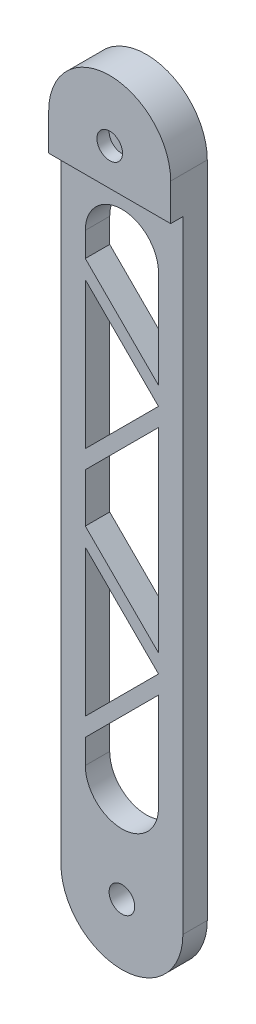
ISO-10303-21;
HEADER;
FILE_DESCRIPTION(('STEP AP214'),'2;1');
FILE_NAME('part.step','',(''),(''),'','','');
FILE_SCHEMA(('AUTOMOTIVE_DESIGN { 1 0 10303 214 1 1 1 1 }'));
ENDSEC;
DATA;
#1=APPLICATION_CONTEXT('core data for automotive mechanical design processes');
#2=APPLICATION_PROTOCOL_DEFINITION('international standard','automotive_design',2000,#1);
#3=PRODUCT_CONTEXT('',#1,'mechanical');
#4=PRODUCT('Part','Part','',(#3));
#5=PRODUCT_RELATED_PRODUCT_CATEGORY('part','',(#4));
#6=PRODUCT_DEFINITION_FORMATION('','',#4);
#7=PRODUCT_DEFINITION_CONTEXT('part definition',#1,'design');
#8=PRODUCT_DEFINITION('design','',#6,#7);
#9=PRODUCT_DEFINITION_SHAPE('','',#8);
#10=(LENGTH_UNIT() NAMED_UNIT(*) SI_UNIT(.MILLI.,.METRE.));
#11=(NAMED_UNIT(*) PLANE_ANGLE_UNIT() SI_UNIT($,.RADIAN.));
#12=(NAMED_UNIT(*) SI_UNIT($,.STERADIAN.) SOLID_ANGLE_UNIT());
#13=UNCERTAINTY_MEASURE_WITH_UNIT(LENGTH_MEASURE(1.E-05),#10,'distance_accuracy_value','');
#14=(GEOMETRIC_REPRESENTATION_CONTEXT(3) GLOBAL_UNCERTAINTY_ASSIGNED_CONTEXT((#13)) GLOBAL_UNIT_ASSIGNED_CONTEXT((#10,
#11,#12)) REPRESENTATION_CONTEXT('',''));
#15=CARTESIAN_POINT('',(0.,0.,0.));
#16=DIRECTION('',(0.,0.,1.));
#17=DIRECTION('',(1.,0.,0.));
#18=AXIS2_PLACEMENT_3D('',#15,#16,#17);
#19=CARTESIAN_POINT('',(0.,0.,4.));
#20=DIRECTION('',(0.,0.,1.));
#21=DIRECTION('',(1.,0.,0.));
#22=AXIS2_PLACEMENT_3D('',#19,#20,#21);
#23=PLANE('',#22);
#24=DIRECTION('',(0.,-1.,0.));
#25=VECTOR('',#24,1.);
#26=CARTESIAN_POINT('',(5.99999999999999,0.,4.));
#27=LINE('',#26,#25);
#28=CARTESIAN_POINT('',(5.99999999999999,38.,4.));
#29=VERTEX_POINT('',#28);
#30=CARTESIAN_POINT('',(5.99999999999999,22.0000000000018,4.));
#31=VERTEX_POINT('',#30);
#32=EDGE_CURVE('E389',#29,#31,#27,.T.);
#33=ORIENTED_EDGE('',*,*,#32,.T.);
#34=DIRECTION('',(0.707106781186546,-0.707106781186549,0.));
#35=VECTOR('',#34,1.);
#36=CARTESIAN_POINT('',(14.0000000000009,14.0000000000008,4.));
#37=LINE('',#36,#35);
#38=CARTESIAN_POINT('',(-6.00000000000002,34.0000000000018,4.));
#39=VERTEX_POINT('',#38);
#40=EDGE_CURVE('E408',#39,#31,#37,.T.);
#41=ORIENTED_EDGE('',*,*,#40,.F.);
#42=DIRECTION('',(0.,-1.,0.));
#43=VECTOR('',#42,1.);
#44=CARTESIAN_POINT('',(-6.00000000000002,0.,4.));
#45=LINE('',#44,#43);
#46=CARTESIAN_POINT('',(-6.00000000000002,38.,4.));
#47=VERTEX_POINT('',#46);
#48=EDGE_CURVE('E368',#47,#39,#45,.T.);
#49=ORIENTED_EDGE('',*,*,#48,.F.);
#50=CARTESIAN_POINT('',(0.,38.,4.));
#51=DIRECTION('',(0.,0.,1.));
#52=DIRECTION('',(1.,0.,0.));
#53=AXIS2_PLACEMENT_3D('',#50,#51,#52);
#54=CIRCLE('',#53,6.00000000000001);
#55=EDGE_CURVE('E415',#29,#47,#54,.T.);
#56=ORIENTED_EDGE('',*,*,#55,.F.);
#57=EDGE_LOOP('',(#33,#41,#49,#56));
#58=FACE_BOUND('',#57,.T.);
#59=DIRECTION('',(0.707106781186546,-0.707106781186549,0.));
#60=VECTOR('',#59,1.);
#61=CARTESIAN_POINT('',(12.5000000000017,12.5000000000016,4.));
#62=LINE('',#61,#60);
#63=CARTESIAN_POINT('',(-6.00000000000002,31.0000000000034,4.));
#64=VERTEX_POINT('',#63);
#65=CARTESIAN_POINT('',(5.99999999999999,19.0000000000002,4.));
#66=VERTEX_POINT('',#65);
#67=EDGE_CURVE('E370',#64,#66,#62,.T.);
#68=ORIENTED_EDGE('',*,*,#67,.T.);
#69=DIRECTION('',(0.707106781186546,0.707106781186549,0.));
#70=VECTOR('',#69,1.);
#71=CARTESIAN_POINT('',(-6.50000000000011,6.50000000000008,4.));
#72=LINE('',#71,#70);
#73=CARTESIAN_POINT('',(-6.00000000000002,7.00000000000017,4.));
#74=VERTEX_POINT('',#73);
#75=EDGE_CURVE('E373',#74,#66,#72,.T.);
#76=ORIENTED_EDGE('',*,*,#75,.F.);
#77=EDGE_CURVE('E251',#64,#74,#45,.T.);
#78=ORIENTED_EDGE('',*,*,#77,.F.);
#79=EDGE_LOOP('',(#68,#76,#78));
#80=FACE_BOUND('',#79,.T.);
#81=CARTESIAN_POINT('',(5.99999999999999,16.0000000000018,4.));
#82=VERTEX_POINT('',#81);
#83=CARTESIAN_POINT('',(5.99999999999999,-16.0000000000018,4.));
#84=VERTEX_POINT('',#83);
#85=EDGE_CURVE('E382',#82,#84,#27,.T.);
#86=ORIENTED_EDGE('',*,*,#85,.T.);
#87=DIRECTION('',(0.707106781186546,-0.707106781186549,0.));
#88=VECTOR('',#87,1.);
#89=CARTESIAN_POINT('',(-5.00000000000088,-5.00000000000086,4.));
#90=LINE('',#89,#88);
#91=CARTESIAN_POINT('',(-6.00000000000002,-4.00000000000172,4.));
#92=VERTEX_POINT('',#91);
#93=EDGE_CURVE('E383',#92,#84,#90,.T.);
#94=ORIENTED_EDGE('',*,*,#93,.F.);
#95=CARTESIAN_POINT('',(-6.00000000000002,4.00000000000172,4.));
#96=VERTEX_POINT('',#95);
#97=EDGE_CURVE('E367',#96,#92,#45,.T.);
#98=ORIENTED_EDGE('',*,*,#97,.F.);
#99=DIRECTION('',(0.707106781186546,0.707106781186549,0.));
#100=VECTOR('',#99,1.);
#101=CARTESIAN_POINT('',(-5.00000000000088,5.00000000000086,4.));
#102=LINE('',#101,#100);
#103=EDGE_CURVE('E380',#96,#82,#102,.T.);
#104=ORIENTED_EDGE('',*,*,#103,.T.);
#105=EDGE_LOOP('',(#86,#94,#98,#104));
#106=FACE_BOUND('',#105,.T.);
#107=DIRECTION('',(0.707106781186546,-0.707106781186549,0.));
#108=VECTOR('',#107,1.);
#109=CARTESIAN_POINT('',(-6.50000000000011,-6.50000000000008,4.));
#110=LINE('',#109,#108);
#111=CARTESIAN_POINT('',(-6.00000000000002,-7.00000000000017,4.));
#112=VERTEX_POINT('',#111);
#113=CARTESIAN_POINT('',(5.99999999999999,-19.0000000000033,4.));
#114=VERTEX_POINT('',#113);
#115=EDGE_CURVE('E394',#112,#114,#110,.T.);
#116=ORIENTED_EDGE('',*,*,#115,.T.);
#117=DIRECTION('',(0.707106781186546,0.707106781186549,0.));
#118=VECTOR('',#117,1.);
#119=CARTESIAN_POINT('',(12.5000000000017,-12.5000000000016,4.));
#120=LINE('',#119,#118);
#121=CARTESIAN_POINT('',(-6.00000000000002,-31.0000000000034,4.));
#122=VERTEX_POINT('',#121);
#123=EDGE_CURVE('E396',#122,#114,#120,.T.);
#124=ORIENTED_EDGE('',*,*,#123,.F.);
#125=EDGE_CURVE('E392',#112,#122,#45,.T.);
#126=ORIENTED_EDGE('',*,*,#125,.F.);
#127=EDGE_LOOP('',(#116,#124,#126));
#128=FACE_BOUND('',#127,.T.);
#129=DIRECTION('',(0.707106781186546,0.707106781186549,0.));
#130=VECTOR('',#129,1.);
#131=CARTESIAN_POINT('',(14.0000000000009,-14.0000000000008,4.));
#132=LINE('',#131,#130);
#133=CARTESIAN_POINT('',(-6.00000000000002,-34.0000000000018,4.));
#134=VERTEX_POINT('',#133);
#135=CARTESIAN_POINT('',(5.99999999999999,-22.0000000000018,4.));
#136=VERTEX_POINT('',#135);
#137=EDGE_CURVE('E402',#134,#136,#132,.T.);
#138=ORIENTED_EDGE('',*,*,#137,.T.);
#139=CARTESIAN_POINT('',(5.99999999999999,-38.,4.));
#140=VERTEX_POINT('',#139);
#141=EDGE_CURVE('E386',#136,#140,#27,.T.);
#142=ORIENTED_EDGE('',*,*,#141,.T.);
#143=CARTESIAN_POINT('',(0.,-38.,4.));
#144=DIRECTION('',(0.,0.,1.));
#145=DIRECTION('',(1.,0.,0.));
#146=AXIS2_PLACEMENT_3D('',#143,#144,#145);
#147=CIRCLE('',#146,6.00000000000001);
#148=CARTESIAN_POINT('',(-6.00000000000002,-38.,4.));
#149=VERTEX_POINT('',#148);
#150=EDGE_CURVE('E403',#149,#140,#147,.T.);
#151=ORIENTED_EDGE('',*,*,#150,.F.);
#152=EDGE_CURVE('E399',#134,#149,#45,.T.);
#153=ORIENTED_EDGE('',*,*,#152,.F.);
#154=EDGE_LOOP('',(#138,#142,#151,#153));
#155=FACE_BOUND('',#154,.T.);
#156=CARTESIAN_POINT('',(0.,-54.,4.));
#157=DIRECTION('',(0.,0.,1.));
#158=DIRECTION('',(1.,0.,0.));
#159=AXIS2_PLACEMENT_3D('',#156,#157,#158);
#160=CIRCLE('',#159,2.1);
#161=CARTESIAN_POINT('',(2.09999999999999,-54.,4.));
#162=VERTEX_POINT('',#161);
#163=EDGE_CURVE('E275',#162,#162,#160,.T.);
#164=ORIENTED_EDGE('',*,*,#163,.F.);
#165=EDGE_LOOP('',(#164));
#166=FACE_BOUND('',#165,.T.);
#167=DIRECTION('',(0.,-1.,0.));
#168=VECTOR('',#167,1.);
#169=CARTESIAN_POINT('',(10.,0.,4.));
#170=LINE('',#169,#168);
#171=CARTESIAN_POINT('',(10.,47.95,4.));
#172=VERTEX_POINT('',#171);
#173=CARTESIAN_POINT('',(9.99999999999999,-54.,4.));
#174=VERTEX_POINT('',#173);
#175=EDGE_CURVE('E350',#172,#174,#170,.T.);
#176=ORIENTED_EDGE('',*,*,#175,.F.);
#177=DIRECTION('',(-1.,0.,0.));
#178=VECTOR('',#177,1.);
#179=CARTESIAN_POINT('',(0.,47.95,4.));
#180=LINE('',#179,#178);
#181=CARTESIAN_POINT('',(-9.99999999999999,47.95,4.));
#182=VERTEX_POINT('',#181);
#183=EDGE_CURVE('E141',#172,#182,#180,.T.);
#184=ORIENTED_EDGE('',*,*,#183,.T.);
#185=DIRECTION('',(0.,-1.,0.));
#186=VECTOR('',#185,1.);
#187=CARTESIAN_POINT('',(-9.99999999999999,0.,4.));
#188=LINE('',#187,#186);
#189=CARTESIAN_POINT('',(-9.99999999999999,-54.,4.));
#190=VERTEX_POINT('',#189);
#191=EDGE_CURVE('E420',#182,#190,#188,.T.);
#192=ORIENTED_EDGE('',*,*,#191,.T.);
#193=CARTESIAN_POINT('',(0.,-54.,4.));
#194=DIRECTION('',(0.,0.,1.));
#195=DIRECTION('',(1.,0.,0.));
#196=AXIS2_PLACEMENT_3D('',#193,#194,#195);
#197=CIRCLE('',#196,10.);
#198=EDGE_CURVE('E263',#190,#174,#197,.T.);
#199=ORIENTED_EDGE('',*,*,#198,.T.);
#200=EDGE_LOOP('',(#176,#184,#192,#199));
#201=FACE_BOUND('',#200,.T.);
#202=ADVANCED_FACE('F131',(#58,#80,#106,#128,#155,#166,#201),#23,.T.);
#203=CARTESIAN_POINT('',(5.99999999999999,0.,4.));
#204=DIRECTION('',(1.,0.,0.));
#205=DIRECTION('',(0.,0.,-1.));
#206=AXIS2_PLACEMENT_3D('',#203,#204,#205);
#207=PLANE('',#206);
#208=DIRECTION('',(0.,-1.,0.));
#209=VECTOR('',#208,1.);
#210=CARTESIAN_POINT('',(5.99999999999999,0.,0.));
#211=LINE('',#210,#209);
#212=CARTESIAN_POINT('',(5.99999999999999,38.,0.));
#213=VERTEX_POINT('',#212);
#214=CARTESIAN_POINT('',(5.99999999999999,22.0000000000018,0.));
#215=VERTEX_POINT('',#214);
#216=EDGE_CURVE('E443',#213,#215,#211,.T.);
#217=ORIENTED_EDGE('',*,*,#216,.T.);
#218=DIRECTION('',(0.,0.,-1.));
#219=VECTOR('',#218,1.);
#220=CARTESIAN_POINT('',(5.99999999999999,22.0000000000018,4.));
#221=LINE('',#220,#219);
#222=EDGE_CURVE('E157',#31,#215,#221,.T.);
#223=ORIENTED_EDGE('',*,*,#222,.F.);
#224=ORIENTED_EDGE('',*,*,#32,.F.);
#225=DIRECTION('',(0.,0.,-1.));
#226=VECTOR('',#225,1.);
#227=CARTESIAN_POINT('',(5.99999999999999,38.,4.));
#228=LINE('',#227,#226);
#229=EDGE_CURVE('E306',#29,#213,#228,.T.);
#230=ORIENTED_EDGE('',*,*,#229,.T.);
#231=EDGE_LOOP('',(#217,#223,#224,#230));
#232=FACE_BOUND('',#231,.T.);
#233=ADVANCED_FACE('F478',(#232),#207,.F.);
#234=CARTESIAN_POINT('',(5.99999999999999,16.0000000000018,0.));
#235=VERTEX_POINT('',#234);
#236=CARTESIAN_POINT('',(5.99999999999999,-16.0000000000018,0.));
#237=VERTEX_POINT('',#236);
#238=EDGE_CURVE('E437',#235,#237,#211,.T.);
#239=ORIENTED_EDGE('',*,*,#238,.T.);
#240=DIRECTION('',(0.,0.,-1.));
#241=VECTOR('',#240,1.);
#242=CARTESIAN_POINT('',(5.99999999999999,-16.0000000000018,4.));
#243=LINE('',#242,#241);
#244=EDGE_CURVE('E334',#84,#237,#243,.T.);
#245=ORIENTED_EDGE('',*,*,#244,.F.);
#246=ORIENTED_EDGE('',*,*,#85,.F.);
#247=DIRECTION('',(0.,0.,-1.));
#248=VECTOR('',#247,1.);
#249=CARTESIAN_POINT('',(5.99999999999999,16.0000000000018,4.));
#250=LINE('',#249,#248);
#251=EDGE_CURVE('E339',#82,#235,#250,.T.);
#252=ORIENTED_EDGE('',*,*,#251,.T.);
#253=EDGE_LOOP('',(#239,#245,#246,#252));
#254=FACE_BOUND('',#253,.T.);
#255=ADVANCED_FACE('F521',(#254),#207,.F.);
#256=CARTESIAN_POINT('',(5.99999999999999,-22.0000000000018,0.));
#257=VERTEX_POINT('',#256);
#258=CARTESIAN_POINT('',(5.99999999999999,-38.,0.));
#259=VERTEX_POINT('',#258);
#260=EDGE_CURVE('E444',#257,#259,#211,.T.);
#261=ORIENTED_EDGE('',*,*,#260,.T.);
#262=DIRECTION('',(0.,0.,-1.));
#263=VECTOR('',#262,1.);
#264=CARTESIAN_POINT('',(5.99999999999999,-38.,4.));
#265=LINE('',#264,#263);
#266=EDGE_CURVE('E312',#140,#259,#265,.T.);
#267=ORIENTED_EDGE('',*,*,#266,.F.);
#268=ORIENTED_EDGE('',*,*,#141,.F.);
#269=DIRECTION('',(0.,0.,-1.));
#270=VECTOR('',#269,1.);
#271=CARTESIAN_POINT('',(5.99999999999999,-22.0000000000018,4.));
#272=LINE('',#271,#270);
#273=EDGE_CURVE('E320',#136,#257,#272,.T.);
#274=ORIENTED_EDGE('',*,*,#273,.T.);
#275=EDGE_LOOP('',(#261,#267,#268,#274));
#276=FACE_BOUND('',#275,.T.);
#277=ADVANCED_FACE('F610',(#276),#207,.F.);
#278=CARTESIAN_POINT('',(0.,-38.,4.));
#279=DIRECTION('',(0.,0.,-1.));
#280=DIRECTION('',(-1.,0.,0.));
#281=AXIS2_PLACEMENT_3D('',#278,#279,#280);
#282=CYLINDRICAL_SURFACE('',#281,6.00000000000001);
#283=CARTESIAN_POINT('',(0.,-38.,0.));
#284=DIRECTION('',(0.,0.,1.));
#285=DIRECTION('',(1.,0.,0.));
#286=AXIS2_PLACEMENT_3D('',#283,#284,#285);
#287=CIRCLE('',#286,6.00000000000001);
#288=CARTESIAN_POINT('',(-6.00000000000002,-38.,0.));
#289=VERTEX_POINT('',#288);
#290=EDGE_CURVE('E463',#289,#259,#287,.T.);
#291=ORIENTED_EDGE('',*,*,#290,.F.);
#292=DIRECTION('',(0.,0.,-1.));
#293=VECTOR('',#292,1.);
#294=CARTESIAN_POINT('',(-6.00000000000002,-38.,4.));
#295=LINE('',#294,#293);
#296=EDGE_CURVE('E309',#149,#289,#295,.T.);
#297=ORIENTED_EDGE('',*,*,#296,.F.);
#298=ORIENTED_EDGE('',*,*,#150,.T.);
#299=ORIENTED_EDGE('',*,*,#266,.T.);
#300=EDGE_LOOP('',(#291,#297,#298,#299));
#301=FACE_BOUND('',#300,.T.);
#302=ADVANCED_FACE('F692',(#301),#282,.F.);
#303=CARTESIAN_POINT('',(-6.00000000000002,0.,4.));
#304=DIRECTION('',(1.,0.,0.));
#305=DIRECTION('',(0.,0.,-1.));
#306=AXIS2_PLACEMENT_3D('',#303,#304,#305);
#307=PLANE('',#306);
#308=DIRECTION('',(0.,-1.,0.));
#309=VECTOR('',#308,1.);
#310=CARTESIAN_POINT('',(-6.00000000000002,0.,0.));
#311=LINE('',#310,#309);
#312=CARTESIAN_POINT('',(-6.00000000000002,38.,0.));
#313=VERTEX_POINT('',#312);
#314=CARTESIAN_POINT('',(-6.00000000000002,34.0000000000018,0.));
#315=VERTEX_POINT('',#314);
#316=EDGE_CURVE('E428',#313,#315,#311,.T.);
#317=ORIENTED_EDGE('',*,*,#316,.F.);
#318=DIRECTION('',(0.,0.,-1.));
#319=VECTOR('',#318,1.);
#320=CARTESIAN_POINT('',(-6.00000000000002,38.,4.));
#321=LINE('',#320,#319);
#322=EDGE_CURVE('E296',#47,#313,#321,.T.);
#323=ORIENTED_EDGE('',*,*,#322,.F.);
#324=ORIENTED_EDGE('',*,*,#48,.T.);
#325=DIRECTION('',(0.,0.,-1.));
#326=VECTOR('',#325,1.);
#327=CARTESIAN_POINT('',(-6.00000000000002,34.0000000000018,4.));
#328=LINE('',#327,#326);
#329=EDGE_CURVE('E291',#39,#315,#328,.T.);
#330=ORIENTED_EDGE('',*,*,#329,.T.);
#331=EDGE_LOOP('',(#317,#323,#324,#330));
#332=FACE_BOUND('',#331,.T.);
#333=ADVANCED_FACE('F489',(#332),#307,.T.);
#334=CARTESIAN_POINT('',(-6.00000000000002,31.0000000000034,0.));
#335=VERTEX_POINT('',#334);
#336=CARTESIAN_POINT('',(-6.00000000000002,7.00000000000017,0.));
#337=VERTEX_POINT('',#336);
#338=EDGE_CURVE('E293',#335,#337,#311,.T.);
#339=ORIENTED_EDGE('',*,*,#338,.F.);
#340=DIRECTION('',(0.,0.,-1.));
#341=VECTOR('',#340,1.);
#342=CARTESIAN_POINT('',(-6.00000000000002,31.0000000000034,4.));
#343=LINE('',#342,#341);
#344=EDGE_CURVE('E337',#64,#335,#343,.T.);
#345=ORIENTED_EDGE('',*,*,#344,.F.);
#346=ORIENTED_EDGE('',*,*,#77,.T.);
#347=DIRECTION('',(0.,0.,-1.));
#348=VECTOR('',#347,1.);
#349=CARTESIAN_POINT('',(-6.00000000000002,7.00000000000017,4.));
#350=LINE('',#349,#348);
#351=EDGE_CURVE('E343',#74,#337,#350,.T.);
#352=ORIENTED_EDGE('',*,*,#351,.T.);
#353=EDGE_LOOP('',(#339,#345,#346,#352));
#354=FACE_BOUND('',#353,.T.);
#355=ADVANCED_FACE('F673',(#354),#307,.T.);
#356=CARTESIAN_POINT('',(-6.00000000000002,4.00000000000172,0.));
#357=VERTEX_POINT('',#356);
#358=CARTESIAN_POINT('',(-6.00000000000002,-4.00000000000172,0.));
#359=VERTEX_POINT('',#358);
#360=EDGE_CURVE('E430',#357,#359,#311,.T.);
#361=ORIENTED_EDGE('',*,*,#360,.F.);
#362=DIRECTION('',(0.,0.,-1.));
#363=VECTOR('',#362,1.);
#364=CARTESIAN_POINT('',(-6.00000000000002,4.00000000000172,4.));
#365=LINE('',#364,#363);
#366=EDGE_CURVE('E329',#96,#357,#365,.T.);
#367=ORIENTED_EDGE('',*,*,#366,.F.);
#368=ORIENTED_EDGE('',*,*,#97,.T.);
#369=DIRECTION('',(0.,0.,-1.));
#370=VECTOR('',#369,1.);
#371=CARTESIAN_POINT('',(-6.00000000000002,-4.00000000000172,4.));
#372=LINE('',#371,#370);
#373=EDGE_CURVE('E335',#92,#359,#372,.T.);
#374=ORIENTED_EDGE('',*,*,#373,.T.);
#375=EDGE_LOOP('',(#361,#367,#368,#374));
#376=FACE_BOUND('',#375,.T.);
#377=ADVANCED_FACE('F535',(#376),#307,.T.);
#378=CARTESIAN_POINT('',(-6.00000000000002,-7.00000000000017,0.));
#379=VERTEX_POINT('',#378);
#380=CARTESIAN_POINT('',(-6.00000000000002,-31.0000000000034,0.));
#381=VERTEX_POINT('',#380);
#382=EDGE_CURVE('E446',#379,#381,#311,.T.);
#383=ORIENTED_EDGE('',*,*,#382,.F.);
#384=DIRECTION('',(0.,0.,-1.));
#385=VECTOR('',#384,1.);
#386=CARTESIAN_POINT('',(-6.00000000000002,-7.00000000000017,4.));
#387=LINE('',#386,#385);
#388=EDGE_CURVE('E313',#112,#379,#387,.T.);
#389=ORIENTED_EDGE('',*,*,#388,.F.);
#390=ORIENTED_EDGE('',*,*,#125,.T.);
#391=DIRECTION('',(0.,0.,-1.));
#392=VECTOR('',#391,1.);
#393=CARTESIAN_POINT('',(-6.00000000000002,-31.0000000000034,4.));
#394=LINE('',#393,#392);
#395=EDGE_CURVE('E325',#122,#381,#394,.T.);
#396=ORIENTED_EDGE('',*,*,#395,.T.);
#397=EDGE_LOOP('',(#383,#389,#390,#396));
#398=FACE_BOUND('',#397,.T.);
#399=ADVANCED_FACE('F581',(#398),#307,.T.);
#400=CARTESIAN_POINT('',(-6.00000000000002,-34.0000000000018,0.));
#401=VERTEX_POINT('',#400);
#402=EDGE_CURVE('E460',#401,#289,#311,.T.);
#403=ORIENTED_EDGE('',*,*,#402,.F.);
#404=DIRECTION('',(0.,0.,-1.));
#405=VECTOR('',#404,1.);
#406=CARTESIAN_POINT('',(-6.00000000000002,-34.0000000000018,4.));
#407=LINE('',#406,#405);
#408=EDGE_CURVE('E318',#134,#401,#407,.T.);
#409=ORIENTED_EDGE('',*,*,#408,.F.);
#410=ORIENTED_EDGE('',*,*,#152,.T.);
#411=ORIENTED_EDGE('',*,*,#296,.T.);
#412=EDGE_LOOP('',(#403,#409,#410,#411));
#413=FACE_BOUND('',#412,.T.);
#414=ADVANCED_FACE('F691',(#413),#307,.T.);
#415=CARTESIAN_POINT('',(0.,38.,4.));
#416=DIRECTION('',(0.,0.,-1.));
#417=DIRECTION('',(-1.,0.,0.));
#418=AXIS2_PLACEMENT_3D('',#415,#416,#417);
#419=CYLINDRICAL_SURFACE('',#418,6.00000000000001);
#420=CARTESIAN_POINT('',(0.,38.,0.));
#421=DIRECTION('',(0.,0.,1.));
#422=DIRECTION('',(1.,0.,0.));
#423=AXIS2_PLACEMENT_3D('',#420,#421,#422);
#424=CIRCLE('',#423,6.00000000000001);
#425=EDGE_CURVE('E474',#213,#313,#424,.T.);
#426=ORIENTED_EDGE('',*,*,#425,.F.);
#427=ORIENTED_EDGE('',*,*,#229,.F.);
#428=ORIENTED_EDGE('',*,*,#55,.T.);
#429=ORIENTED_EDGE('',*,*,#322,.T.);
#430=EDGE_LOOP('',(#426,#427,#428,#429));
#431=FACE_BOUND('',#430,.T.);
#432=ADVANCED_FACE('F487',(#431),#419,.F.);
#433=CARTESIAN_POINT('',(10.,0.,4.));
#434=DIRECTION('',(1.,0.,0.));
#435=DIRECTION('',(0.,0.,-1.));
#436=AXIS2_PLACEMENT_3D('',#433,#434,#435);
#437=PLANE('',#436);
#438=DIRECTION('',(0.,0.,-1.));
#439=VECTOR('',#438,1.);
#440=CARTESIAN_POINT('',(9.99999999999999,-54.,4.));
#441=LINE('',#440,#439);
#442=CARTESIAN_POINT('',(9.99999999999999,-54.,0.));
#443=VERTEX_POINT('',#442);
#444=EDGE_CURVE('E247',#174,#443,#441,.T.);
#445=ORIENTED_EDGE('',*,*,#444,.T.);
#446=DIRECTION('',(0.,-1.,0.));
#447=VECTOR('',#446,1.);
#448=CARTESIAN_POINT('',(10.,0.,0.));
#449=LINE('',#448,#447);
#450=CARTESIAN_POINT('',(10.,54.,0.));
#451=VERTEX_POINT('',#450);
#452=EDGE_CURVE('E239',#451,#443,#449,.T.);
#453=ORIENTED_EDGE('',*,*,#452,.F.);
#454=DIRECTION('',(0.,0.,-1.));
#455=VECTOR('',#454,1.);
#456=CARTESIAN_POINT('',(10.,54.,4.));
#457=LINE('',#456,#455);
#458=CARTESIAN_POINT('',(10.,54.,6.));
#459=VERTEX_POINT('',#458);
#460=EDGE_CURVE('E244',#459,#451,#457,.T.);
#461=ORIENTED_EDGE('',*,*,#460,.F.);
#462=DIRECTION('',(0.,-1.,0.));
#463=VECTOR('',#462,1.);
#464=CARTESIAN_POINT('',(10.,0.,6.));
#465=LINE('',#464,#463);
#466=CARTESIAN_POINT('',(10.,47.95,6.));
#467=VERTEX_POINT('',#466);
#468=EDGE_CURVE('E627',#459,#467,#465,.T.);
#469=ORIENTED_EDGE('',*,*,#468,.T.);
#470=DIRECTION('',(0.,0.,-1.));
#471=VECTOR('',#470,1.);
#472=CARTESIAN_POINT('',(10.,47.95,6.));
#473=LINE('',#472,#471);
#474=EDGE_CURVE('E358',#467,#172,#473,.T.);
#475=ORIENTED_EDGE('',*,*,#474,.T.);
#476=ORIENTED_EDGE('',*,*,#175,.T.);
#477=EDGE_LOOP('',(#445,#453,#461,#469,#475,#476));
#478=FACE_BOUND('',#477,.T.);
#479=ADVANCED_FACE('F245',(#478),#437,.T.);
#480=CARTESIAN_POINT('',(-9.99999999999999,0.,4.));
#481=DIRECTION('',(1.,0.,0.));
#482=DIRECTION('',(0.,0.,-1.));
#483=AXIS2_PLACEMENT_3D('',#480,#481,#482);
#484=PLANE('',#483);
#485=ORIENTED_EDGE('',*,*,#191,.F.);
#486=DIRECTION('',(0.,0.,-1.));
#487=VECTOR('',#486,1.);
#488=CARTESIAN_POINT('',(-9.99999999999999,47.95,6.));
#489=LINE('',#488,#487);
#490=CARTESIAN_POINT('',(-9.99999999999999,47.95,6.));
#491=VERTEX_POINT('',#490);
#492=EDGE_CURVE('E147',#491,#182,#489,.T.);
#493=ORIENTED_EDGE('',*,*,#492,.F.);
#494=DIRECTION('',(0.,-1.,0.));
#495=VECTOR('',#494,1.);
#496=CARTESIAN_POINT('',(-9.99999999999999,0.,6.));
#497=LINE('',#496,#495);
#498=CARTESIAN_POINT('',(-9.99999999999999,54.,6.));
#499=VERTEX_POINT('',#498);
#500=EDGE_CURVE('E636',#499,#491,#497,.T.);
#501=ORIENTED_EDGE('',*,*,#500,.F.);
#502=DIRECTION('',(0.,0.,-1.));
#503=VECTOR('',#502,1.);
#504=CARTESIAN_POINT('',(-9.99999999999999,54.,4.));
#505=LINE('',#504,#503);
#506=CARTESIAN_POINT('',(-9.99999999999999,54.,0.));
#507=VERTEX_POINT('',#506);
#508=EDGE_CURVE('E287',#499,#507,#505,.T.);
#509=ORIENTED_EDGE('',*,*,#508,.T.);
#510=DIRECTION('',(0.,-1.,0.));
#511=VECTOR('',#510,1.);
#512=CARTESIAN_POINT('',(-9.99999999999999,0.,0.));
#513=LINE('',#512,#511);
#514=CARTESIAN_POINT('',(-9.99999999999999,-54.,0.));
#515=VERTEX_POINT('',#514);
#516=EDGE_CURVE('E253',#507,#515,#513,.T.);
#517=ORIENTED_EDGE('',*,*,#516,.T.);
#518=DIRECTION('',(0.,0.,-1.));
#519=VECTOR('',#518,1.);
#520=CARTESIAN_POINT('',(-9.99999999999999,-54.,4.));
#521=LINE('',#520,#519);
#522=EDGE_CURVE('E283',#190,#515,#521,.T.);
#523=ORIENTED_EDGE('',*,*,#522,.F.);
#524=EDGE_LOOP('',(#485,#493,#501,#509,#517,#523));
#525=FACE_BOUND('',#524,.T.);
#526=ADVANCED_FACE('F653',(#525),#484,.F.);
#527=CARTESIAN_POINT('',(14.0000000000009,14.0000000000008,4.));
#528=DIRECTION('',(0.707106781186549,0.707106781186546,0.));
#529=DIRECTION('',(-0.707106781186546,0.707106781186549,0.));
#530=AXIS2_PLACEMENT_3D('',#527,#528,#529);
#531=PLANE('',#530);
#532=DIRECTION('',(0.707106781186546,-0.707106781186549,0.));
#533=VECTOR('',#532,1.);
#534=CARTESIAN_POINT('',(14.0000000000009,14.0000000000008,0.));
#535=LINE('',#534,#533);
#536=EDGE_CURVE('E470',#315,#215,#535,.T.);
#537=ORIENTED_EDGE('',*,*,#536,.F.);
#538=ORIENTED_EDGE('',*,*,#329,.F.);
#539=ORIENTED_EDGE('',*,*,#40,.T.);
#540=ORIENTED_EDGE('',*,*,#222,.T.);
#541=EDGE_LOOP('',(#537,#538,#539,#540));
#542=FACE_BOUND('',#541,.T.);
#543=ADVANCED_FACE('F570',(#542),#531,.T.);
#544=CARTESIAN_POINT('',(12.5000000000017,12.5000000000016,4.));
#545=DIRECTION('',(0.707106781186549,0.707106781186546,0.));
#546=DIRECTION('',(-0.707106781186546,0.707106781186549,0.));
#547=AXIS2_PLACEMENT_3D('',#544,#545,#546);
#548=PLANE('',#547);
#549=DIRECTION('',(0.707106781186546,-0.707106781186549,0.));
#550=VECTOR('',#549,1.);
#551=CARTESIAN_POINT('',(12.5000000000017,12.5000000000016,0.));
#552=LINE('',#551,#550);
#553=CARTESIAN_POINT('',(5.99999999999999,19.0000000000002,0.));
#554=VERTEX_POINT('',#553);
#555=EDGE_CURVE('E424',#335,#554,#552,.T.);
#556=ORIENTED_EDGE('',*,*,#555,.T.);
#557=DIRECTION('',(0.,0.,-1.));
#558=VECTOR('',#557,1.);
#559=CARTESIAN_POINT('',(5.99999999999999,19.0000000000002,4.));
#560=LINE('',#559,#558);
#561=EDGE_CURVE('E349',#66,#554,#560,.T.);
#562=ORIENTED_EDGE('',*,*,#561,.F.);
#563=ORIENTED_EDGE('',*,*,#67,.F.);
#564=ORIENTED_EDGE('',*,*,#344,.T.);
#565=EDGE_LOOP('',(#556,#562,#563,#564));
#566=FACE_BOUND('',#565,.T.);
#567=ADVANCED_FACE('F663',(#566),#548,.F.);
#568=CARTESIAN_POINT('',(0.,0.,0.));
#569=DIRECTION('',(0.,0.,1.));
#570=DIRECTION('',(1.,0.,0.));
#571=AXIS2_PLACEMENT_3D('',#568,#569,#570);
#572=PLANE('',#571);
#573=ORIENTED_EDGE('',*,*,#452,.T.);
#574=CARTESIAN_POINT('',(0.,-54.,0.));
#575=DIRECTION('',(0.,0.,1.));
#576=DIRECTION('',(1.,0.,0.));
#577=AXIS2_PLACEMENT_3D('',#574,#575,#576);
#578=CIRCLE('',#577,10.);
#579=EDGE_CURVE('E272',#515,#443,#578,.T.);
#580=ORIENTED_EDGE('',*,*,#579,.F.);
#581=ORIENTED_EDGE('',*,*,#516,.F.);
#582=CARTESIAN_POINT('',(0.,54.,0.));
#583=DIRECTION('',(0.,0.,1.));
#584=DIRECTION('',(1.,0.,0.));
#585=AXIS2_PLACEMENT_3D('',#582,#583,#584);
#586=CIRCLE('',#585,10.);
#587=EDGE_CURVE('E257',#451,#507,#586,.T.);
#588=ORIENTED_EDGE('',*,*,#587,.F.);
#589=EDGE_LOOP('',(#573,#580,#581,#588));
#590=FACE_BOUND('',#589,.T.);
#591=CARTESIAN_POINT('',(0.,-54.,0.));
#592=DIRECTION('',(0.,0.,1.));
#593=DIRECTION('',(1.,0.,0.));
#594=AXIS2_PLACEMENT_3D('',#591,#592,#593);
#595=CIRCLE('',#594,2.1);
#596=CARTESIAN_POINT('',(2.09999999999999,-54.,0.));
#597=VERTEX_POINT('',#596);
#598=EDGE_CURVE('E280',#597,#597,#595,.T.);
#599=ORIENTED_EDGE('',*,*,#598,.T.);
#600=EDGE_LOOP('',(#599));
#601=FACE_BOUND('',#600,.T.);
#602=ORIENTED_EDGE('',*,*,#260,.F.);
#603=DIRECTION('',(0.707106781186546,0.707106781186549,0.));
#604=VECTOR('',#603,1.);
#605=CARTESIAN_POINT('',(14.0000000000009,-14.0000000000008,0.));
#606=LINE('',#605,#604);
#607=EDGE_CURVE('E456',#401,#257,#606,.T.);
#608=ORIENTED_EDGE('',*,*,#607,.F.);
#609=ORIENTED_EDGE('',*,*,#402,.T.);
#610=ORIENTED_EDGE('',*,*,#290,.T.);
#611=EDGE_LOOP('',(#602,#608,#609,#610));
#612=FACE_BOUND('',#611,.T.);
#613=DIRECTION('',(0.707106781186546,0.707106781186549,0.));
#614=VECTOR('',#613,1.);
#615=CARTESIAN_POINT('',(12.5000000000017,-12.5000000000016,0.));
#616=LINE('',#615,#614);
#617=CARTESIAN_POINT('',(5.99999999999999,-19.0000000000033,0.));
#618=VERTEX_POINT('',#617);
#619=EDGE_CURVE('E453',#381,#618,#616,.T.);
#620=ORIENTED_EDGE('',*,*,#619,.T.);
#621=DIRECTION('',(0.707106781186546,-0.707106781186549,0.));
#622=VECTOR('',#621,1.);
#623=CARTESIAN_POINT('',(-6.50000000000011,-6.50000000000008,0.));
#624=LINE('',#623,#622);
#625=EDGE_CURVE('E448',#379,#618,#624,.T.);
#626=ORIENTED_EDGE('',*,*,#625,.F.);
#627=ORIENTED_EDGE('',*,*,#382,.T.);
#628=EDGE_LOOP('',(#620,#626,#627));
#629=FACE_BOUND('',#628,.T.);
#630=DIRECTION('',(0.707106781186546,-0.707106781186549,0.));
#631=VECTOR('',#630,1.);
#632=CARTESIAN_POINT('',(-5.00000000000088,-5.00000000000086,0.));
#633=LINE('',#632,#631);
#634=EDGE_CURVE('E442',#359,#237,#633,.T.);
#635=ORIENTED_EDGE('',*,*,#634,.T.);
#636=ORIENTED_EDGE('',*,*,#238,.F.);
#637=DIRECTION('',(0.707106781186546,0.707106781186549,0.));
#638=VECTOR('',#637,1.);
#639=CARTESIAN_POINT('',(-5.00000000000088,5.00000000000086,0.));
#640=LINE('',#639,#638);
#641=EDGE_CURVE('E434',#357,#235,#640,.T.);
#642=ORIENTED_EDGE('',*,*,#641,.F.);
#643=ORIENTED_EDGE('',*,*,#360,.T.);
#644=EDGE_LOOP('',(#635,#636,#642,#643));
#645=FACE_BOUND('',#644,.T.);
#646=DIRECTION('',(0.707106781186546,0.707106781186549,0.));
#647=VECTOR('',#646,1.);
#648=CARTESIAN_POINT('',(-6.50000000000011,6.50000000000008,0.));
#649=LINE('',#648,#647);
#650=EDGE_CURVE('E431',#337,#554,#649,.T.);
#651=ORIENTED_EDGE('',*,*,#650,.T.);
#652=ORIENTED_EDGE('',*,*,#555,.F.);
#653=ORIENTED_EDGE('',*,*,#338,.T.);
#654=EDGE_LOOP('',(#651,#652,#653));
#655=FACE_BOUND('',#654,.T.);
#656=ORIENTED_EDGE('',*,*,#536,.T.);
#657=ORIENTED_EDGE('',*,*,#216,.F.);
#658=ORIENTED_EDGE('',*,*,#425,.T.);
#659=ORIENTED_EDGE('',*,*,#316,.T.);
#660=EDGE_LOOP('',(#656,#657,#658,#659));
#661=FACE_BOUND('',#660,.T.);
#662=ADVANCED_FACE('F270',(#590,#601,#612,#629,#645,#655,#661),#572,.F.);
#663=CARTESIAN_POINT('',(-6.50000000000011,6.50000000000008,4.));
#664=DIRECTION('',(-0.707106781186549,0.707106781186546,0.));
#665=DIRECTION('',(-0.707106781186546,-0.707106781186549,0.));
#666=AXIS2_PLACEMENT_3D('',#663,#664,#665);
#667=PLANE('',#666);
#668=ORIENTED_EDGE('',*,*,#650,.F.);
#669=ORIENTED_EDGE('',*,*,#351,.F.);
#670=ORIENTED_EDGE('',*,*,#75,.T.);
#671=ORIENTED_EDGE('',*,*,#561,.T.);
#672=EDGE_LOOP('',(#668,#669,#670,#671));
#673=FACE_BOUND('',#672,.T.);
#674=ADVANCED_FACE('F674',(#673),#667,.T.);
#675=CARTESIAN_POINT('',(-5.00000000000088,5.00000000000086,4.));
#676=DIRECTION('',(-0.707106781186549,0.707106781186546,0.));
#677=DIRECTION('',(-0.707106781186546,-0.707106781186549,0.));
#678=AXIS2_PLACEMENT_3D('',#675,#676,#677);
#679=PLANE('',#678);
#680=ORIENTED_EDGE('',*,*,#641,.T.);
#681=ORIENTED_EDGE('',*,*,#251,.F.);
#682=ORIENTED_EDGE('',*,*,#103,.F.);
#683=ORIENTED_EDGE('',*,*,#366,.T.);
#684=EDGE_LOOP('',(#680,#681,#682,#683));
#685=FACE_BOUND('',#684,.T.);
#686=ADVANCED_FACE('F530',(#685),#679,.F.);
#687=CARTESIAN_POINT('',(-5.00000000000088,-5.00000000000086,4.));
#688=DIRECTION('',(0.707106781186549,0.707106781186546,0.));
#689=DIRECTION('',(-0.707106781186546,0.707106781186549,0.));
#690=AXIS2_PLACEMENT_3D('',#687,#688,#689);
#691=PLANE('',#690);
#692=ORIENTED_EDGE('',*,*,#634,.F.);
#693=ORIENTED_EDGE('',*,*,#373,.F.);
#694=ORIENTED_EDGE('',*,*,#93,.T.);
#695=ORIENTED_EDGE('',*,*,#244,.T.);
#696=EDGE_LOOP('',(#692,#693,#694,#695));
#697=FACE_BOUND('',#696,.T.);
#698=ADVANCED_FACE('F519',(#697),#691,.T.);
#699=CARTESIAN_POINT('',(-6.50000000000011,-6.50000000000008,4.));
#700=DIRECTION('',(0.707106781186549,0.707106781186546,0.));
#701=DIRECTION('',(-0.707106781186546,0.707106781186549,0.));
#702=AXIS2_PLACEMENT_3D('',#699,#700,#701);
#703=PLANE('',#702);
#704=ORIENTED_EDGE('',*,*,#625,.T.);
#705=DIRECTION('',(0.,0.,-1.));
#706=VECTOR('',#705,1.);
#707=CARTESIAN_POINT('',(5.99999999999999,-19.0000000000033,4.));
#708=LINE('',#707,#706);
#709=EDGE_CURVE('E327',#114,#618,#708,.T.);
#710=ORIENTED_EDGE('',*,*,#709,.F.);
#711=ORIENTED_EDGE('',*,*,#115,.F.);
#712=ORIENTED_EDGE('',*,*,#388,.T.);
#713=EDGE_LOOP('',(#704,#710,#711,#712));
#714=FACE_BOUND('',#713,.T.);
#715=ADVANCED_FACE('F586',(#714),#703,.F.);
#716=CARTESIAN_POINT('',(12.5000000000017,-12.5000000000016,4.));
#717=DIRECTION('',(-0.707106781186549,0.707106781186546,0.));
#718=DIRECTION('',(-0.707106781186546,-0.707106781186549,0.));
#719=AXIS2_PLACEMENT_3D('',#716,#717,#718);
#720=PLANE('',#719);
#721=ORIENTED_EDGE('',*,*,#619,.F.);
#722=ORIENTED_EDGE('',*,*,#395,.F.);
#723=ORIENTED_EDGE('',*,*,#123,.T.);
#724=ORIENTED_EDGE('',*,*,#709,.T.);
#725=EDGE_LOOP('',(#721,#722,#723,#724));
#726=FACE_BOUND('',#725,.T.);
#727=ADVANCED_FACE('F589',(#726),#720,.T.);
#728=CARTESIAN_POINT('',(14.0000000000009,-14.0000000000008,4.));
#729=DIRECTION('',(-0.707106781186549,0.707106781186546,0.));
#730=DIRECTION('',(-0.707106781186546,-0.707106781186549,0.));
#731=AXIS2_PLACEMENT_3D('',#728,#729,#730);
#732=PLANE('',#731);
#733=ORIENTED_EDGE('',*,*,#607,.T.);
#734=ORIENTED_EDGE('',*,*,#273,.F.);
#735=ORIENTED_EDGE('',*,*,#137,.F.);
#736=ORIENTED_EDGE('',*,*,#408,.T.);
#737=EDGE_LOOP('',(#733,#734,#735,#736));
#738=FACE_BOUND('',#737,.T.);
#739=ADVANCED_FACE('F597',(#738),#732,.F.);
#740=CARTESIAN_POINT('',(0.,-54.,4.));
#741=DIRECTION('',(0.,0.,-1.));
#742=DIRECTION('',(-1.,0.,0.));
#743=AXIS2_PLACEMENT_3D('',#740,#741,#742);
#744=CYLINDRICAL_SURFACE('',#743,2.1);
#745=ORIENTED_EDGE('',*,*,#163,.T.);
#746=EDGE_LOOP('',(#745));
#747=FACE_BOUND('',#746,.T.);
#748=ORIENTED_EDGE('',*,*,#598,.F.);
#749=EDGE_LOOP('',(#748));
#750=FACE_BOUND('',#749,.T.);
#751=ADVANCED_FACE('F690',(#747,#750),#744,.F.);
#752=CARTESIAN_POINT('',(0.,-54.,4.));
#753=DIRECTION('',(0.,0.,-1.));
#754=DIRECTION('',(-1.,0.,0.));
#755=AXIS2_PLACEMENT_3D('',#752,#753,#754);
#756=CYLINDRICAL_SURFACE('',#755,10.);
#757=ORIENTED_EDGE('',*,*,#579,.T.);
#758=ORIENTED_EDGE('',*,*,#444,.F.);
#759=ORIENTED_EDGE('',*,*,#198,.F.);
#760=ORIENTED_EDGE('',*,*,#522,.T.);
#761=EDGE_LOOP('',(#757,#758,#759,#760));
#762=FACE_BOUND('',#761,.T.);
#763=ADVANCED_FACE('F655',(#762),#756,.T.);
#764=CARTESIAN_POINT('',(0.,54.,4.));
#765=DIRECTION('',(0.,0.,-1.));
#766=DIRECTION('',(-1.,0.,0.));
#767=AXIS2_PLACEMENT_3D('',#764,#765,#766);
#768=CYLINDRICAL_SURFACE('',#767,10.);
#769=ORIENTED_EDGE('',*,*,#587,.T.);
#770=ORIENTED_EDGE('',*,*,#508,.F.);
#771=CARTESIAN_POINT('',(0.,54.,6.));
#772=DIRECTION('',(0.,0.,1.));
#773=DIRECTION('',(1.,0.,0.));
#774=AXIS2_PLACEMENT_3D('',#771,#772,#773);
#775=CIRCLE('',#774,10.);
#776=EDGE_CURVE('E264',#459,#499,#775,.T.);
#777=ORIENTED_EDGE('',*,*,#776,.F.);
#778=ORIENTED_EDGE('',*,*,#460,.T.);
#779=EDGE_LOOP('',(#769,#770,#777,#778));
#780=FACE_BOUND('',#779,.T.);
#781=ADVANCED_FACE('F136',(#780),#768,.T.);
#782=CARTESIAN_POINT('',(0.,54.,6.));
#783=DIRECTION('',(0.,0.,-1.));
#784=DIRECTION('',(-1.,0.,0.));
#785=AXIS2_PLACEMENT_3D('',#782,#783,#784);
#786=CYLINDRICAL_SURFACE('',#785,2.1);
#787=CARTESIAN_POINT('',(0.,54.,4.));
#788=DIRECTION('',(0.,0.,1.));
#789=DIRECTION('',(1.,0.,0.));
#790=AXIS2_PLACEMENT_3D('',#787,#788,#789);
#791=CIRCLE('',#790,2.1);
#792=CARTESIAN_POINT('',(2.09999999999999,54.,4.));
#793=VERTEX_POINT('',#792);
#794=EDGE_CURVE('E12',#793,#793,#791,.F.);
#795=ORIENTED_EDGE('',*,*,#794,.T.);
#796=EDGE_LOOP('',(#795));
#797=FACE_BOUND('',#796,.T.);
#798=CARTESIAN_POINT('',(0.,54.,6.));
#799=DIRECTION('',(0.,0.,1.));
#800=DIRECTION('',(1.,0.,0.));
#801=AXIS2_PLACEMENT_3D('',#798,#799,#800);
#802=CIRCLE('',#801,2.1);
#803=CARTESIAN_POINT('',(2.09999999999999,54.,6.));
#804=VERTEX_POINT('',#803);
#805=EDGE_CURVE('E630',#804,#804,#802,.T.);
#806=ORIENTED_EDGE('',*,*,#805,.T.);
#807=EDGE_LOOP('',(#806));
#808=FACE_BOUND('',#807,.T.);
#809=ADVANCED_FACE('F625',(#797,#808),#786,.F.);
#810=CARTESIAN_POINT('',(0.,47.95,6.));
#811=DIRECTION('',(0.,1.,0.));
#812=DIRECTION('',(0.,0.,1.));
#813=AXIS2_PLACEMENT_3D('',#810,#811,#812);
#814=PLANE('',#813);
#815=ORIENTED_EDGE('',*,*,#183,.F.);
#816=ORIENTED_EDGE('',*,*,#474,.F.);
#817=DIRECTION('',(1.,0.,0.));
#818=VECTOR('',#817,1.);
#819=CARTESIAN_POINT('',(0.,47.95,6.));
#820=LINE('',#819,#818);
#821=EDGE_CURVE('E359',#491,#467,#820,.T.);
#822=ORIENTED_EDGE('',*,*,#821,.F.);
#823=ORIENTED_EDGE('',*,*,#492,.T.);
#824=EDGE_LOOP('',(#815,#816,#822,#823));
#825=FACE_BOUND('',#824,.T.);
#826=ADVANCED_FACE('F617',(#825),#814,.F.);
#827=CARTESIAN_POINT('',(0.,0.,6.));
#828=DIRECTION('',(0.,0.,1.));
#829=DIRECTION('',(1.,0.,0.));
#830=AXIS2_PLACEMENT_3D('',#827,#828,#829);
#831=PLANE('',#830);
#832=ORIENTED_EDGE('',*,*,#805,.F.);
#833=EDGE_LOOP('',(#832));
#834=FACE_BOUND('',#833,.T.);
#835=ORIENTED_EDGE('',*,*,#468,.F.);
#836=ORIENTED_EDGE('',*,*,#776,.T.);
#837=ORIENTED_EDGE('',*,*,#500,.T.);
#838=ORIENTED_EDGE('',*,*,#821,.T.);
#839=EDGE_LOOP('',(#835,#836,#837,#838));
#840=FACE_BOUND('',#839,.T.);
#841=ADVANCED_FACE('F615',(#834,#840),#831,.T.);
#842=ORIENTED_EDGE('',*,*,#794,.F.);
#843=EDGE_LOOP('',(#842));
#844=FACE_BOUND('',#843,.T.);
#845=ADVANCED_FACE('F604',(#844),#23,.T.);
#846=CLOSED_SHELL('',(#202,#233,#255,#277,#302,#333,#355,#377,#399,#414,#432,#479,#526,#543,
#567,#662,#674,#686,#698,#715,#727,#739,#751,#763,#781,#809,#826,#841,#845));
#847=MANIFOLD_SOLID_BREP('B2',#846);
#848=ADVANCED_BREP_SHAPE_REPRESENTATION('',(#18,#847),#14);
#849=SHAPE_DEFINITION_REPRESENTATION(#9,#848);
ENDSEC;
END-ISO-10303-21;
